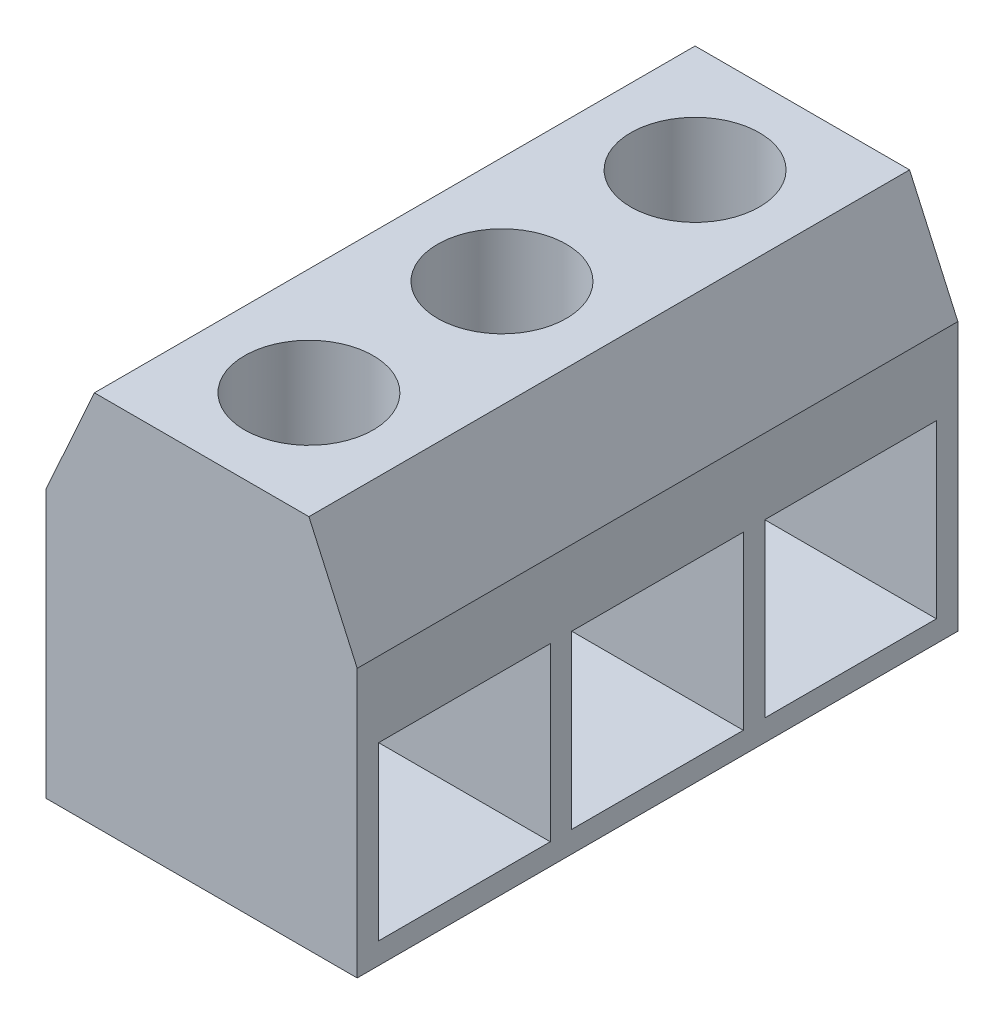
ISO-10303-21;
HEADER;
FILE_DESCRIPTION(('STEP AP214'),'2;1');
FILE_NAME('part.step','',(''),(''),'','','');
FILE_SCHEMA(('AUTOMOTIVE_DESIGN { 1 0 10303 214 1 1 1 1 }'));
ENDSEC;
DATA;
#1=APPLICATION_CONTEXT('core data for automotive mechanical design processes');
#2=APPLICATION_PROTOCOL_DEFINITION('international standard','automotive_design',2000,#1);
#3=PRODUCT_CONTEXT('',#1,'mechanical');
#4=PRODUCT('Part','Part','',(#3));
#5=PRODUCT_RELATED_PRODUCT_CATEGORY('part','',(#4));
#6=PRODUCT_DEFINITION_FORMATION('','',#4);
#7=PRODUCT_DEFINITION_CONTEXT('part definition',#1,'design');
#8=PRODUCT_DEFINITION('design','',#6,#7);
#9=PRODUCT_DEFINITION_SHAPE('','',#8);
#10=(LENGTH_UNIT() NAMED_UNIT(*) SI_UNIT(.MILLI.,.METRE.));
#11=(NAMED_UNIT(*) PLANE_ANGLE_UNIT() SI_UNIT($,.RADIAN.));
#12=(NAMED_UNIT(*) SI_UNIT($,.STERADIAN.) SOLID_ANGLE_UNIT());
#13=UNCERTAINTY_MEASURE_WITH_UNIT(LENGTH_MEASURE(1.E-05),#10,'distance_accuracy_value','');
#14=(GEOMETRIC_REPRESENTATION_CONTEXT(3) GLOBAL_UNCERTAINTY_ASSIGNED_CONTEXT((#13)) GLOBAL_UNIT_ASSIGNED_CONTEXT((#10,
#11,#12)) REPRESENTATION_CONTEXT('',''));
#15=CARTESIAN_POINT('',(0.,0.,0.));
#16=DIRECTION('',(0.,0.,1.));
#17=DIRECTION('',(1.,0.,0.));
#18=AXIS2_PLACEMENT_3D('',#15,#16,#17);
#19=CARTESIAN_POINT('',(0.,0.,14.224));
#20=DIRECTION('',(0.,1.,0.));
#21=DIRECTION('',(0.,0.,1.));
#22=AXIS2_PLACEMENT_3D('',#19,#20,#21);
#23=PLANE('',#22);
#24=DIRECTION('',(0.,0.,-1.));
#25=VECTOR('',#24,1.);
#26=CARTESIAN_POINT('',(1.778,0.,1.27));
#27=LINE('',#26,#25);
#28=CARTESIAN_POINT('',(1.778,0.,1.27));
#29=VERTEX_POINT('',#28);
#30=CARTESIAN_POINT('',(1.778,0.,0.));
#31=VERTEX_POINT('',#30);
#32=EDGE_CURVE('E198',#29,#31,#27,.T.);
#33=ORIENTED_EDGE('',*,*,#32,.T.);
#34=DIRECTION('',(1.,0.,0.));
#35=VECTOR('',#34,1.);
#36=CARTESIAN_POINT('',(0.,0.,0.));
#37=LINE('',#36,#35);
#38=CARTESIAN_POINT('',(7.366,0.,0.));
#39=VERTEX_POINT('',#38);
#40=EDGE_CURVE('E345',#31,#39,#37,.T.);
#41=ORIENTED_EDGE('',*,*,#40,.T.);
#42=DIRECTION('',(0.,0.,-1.));
#43=VECTOR('',#42,1.);
#44=CARTESIAN_POINT('',(7.366,0.,14.224));
#45=LINE('',#44,#43);
#46=CARTESIAN_POINT('',(7.366,0.,14.224));
#47=VERTEX_POINT('',#46);
#48=EDGE_CURVE('E44',#47,#39,#45,.T.);
#49=ORIENTED_EDGE('',*,*,#48,.F.);
#50=DIRECTION('',(1.,0.,0.));
#51=VECTOR('',#50,1.);
#52=CARTESIAN_POINT('',(0.,0.,14.224));
#53=LINE('',#52,#51);
#54=CARTESIAN_POINT('',(0.,0.,14.224));
#55=VERTEX_POINT('',#54);
#56=EDGE_CURVE('E331',#55,#47,#53,.T.);
#57=ORIENTED_EDGE('',*,*,#56,.F.);
#58=DIRECTION('',(0.,0.,-1.));
#59=VECTOR('',#58,1.);
#60=CARTESIAN_POINT('',(0.,0.,14.224));
#61=LINE('',#60,#59);
#62=CARTESIAN_POINT('',(0.,0.,0.));
#63=VERTEX_POINT('',#62);
#64=EDGE_CURVE('E11',#55,#63,#61,.T.);
#65=ORIENTED_EDGE('',*,*,#64,.T.);
#66=CARTESIAN_POINT('',(1.016,0.,0.));
#67=VERTEX_POINT('',#66);
#68=EDGE_CURVE('E346',#63,#67,#37,.T.);
#69=ORIENTED_EDGE('',*,*,#68,.T.);
#70=DIRECTION('',(0.,0.,-1.));
#71=VECTOR('',#70,1.);
#72=CARTESIAN_POINT('',(1.016,0.,1.27));
#73=LINE('',#72,#71);
#74=CARTESIAN_POINT('',(1.016,0.,1.27));
#75=VERTEX_POINT('',#74);
#76=EDGE_CURVE('E52',#75,#67,#73,.T.);
#77=ORIENTED_EDGE('',*,*,#76,.F.);
#78=DIRECTION('',(1.,0.,0.));
#79=VECTOR('',#78,1.);
#80=CARTESIAN_POINT('',(1.778,0.,1.27));
#81=LINE('',#80,#79);
#82=EDGE_CURVE('E192',#75,#29,#81,.T.);
#83=ORIENTED_EDGE('',*,*,#82,.T.);
#84=EDGE_LOOP('',(#33,#41,#49,#57,#65,#69,#77,#83));
#85=FACE_BOUND('',#84,.T.);
#86=ADVANCED_FACE('F35',(#85),#23,.F.);
#87=CARTESIAN_POINT('',(0.,0.,0.));
#88=DIRECTION('',(0.,0.,-1.));
#89=DIRECTION('',(-1.,0.,0.));
#90=AXIS2_PLACEMENT_3D('',#87,#88,#89);
#91=PLANE('',#90);
#92=ORIENTED_EDGE('',*,*,#40,.F.);
#93=DIRECTION('',(0.,1.,0.));
#94=VECTOR('',#93,1.);
#95=CARTESIAN_POINT('',(1.778,6.35,0.));
#96=LINE('',#95,#94);
#97=CARTESIAN_POINT('',(1.778,6.35,0.));
#98=VERTEX_POINT('',#97);
#99=EDGE_CURVE('E201',#31,#98,#96,.T.);
#100=ORIENTED_EDGE('',*,*,#99,.T.);
#101=DIRECTION('',(-1.,0.,0.));
#102=VECTOR('',#101,1.);
#103=CARTESIAN_POINT('',(1.016,6.35,0.));
#104=LINE('',#103,#102);
#105=CARTESIAN_POINT('',(1.016,6.35,0.));
#106=VERTEX_POINT('',#105);
#107=EDGE_CURVE('E209',#98,#106,#104,.T.);
#108=ORIENTED_EDGE('',*,*,#107,.T.);
#109=DIRECTION('',(0.,-1.,0.));
#110=VECTOR('',#109,1.);
#111=CARTESIAN_POINT('',(1.016,0.,0.));
#112=LINE('',#111,#110);
#113=EDGE_CURVE('E207',#106,#67,#112,.T.);
#114=ORIENTED_EDGE('',*,*,#113,.T.);
#115=ORIENTED_EDGE('',*,*,#68,.F.);
#116=DIRECTION('',(0.,-1.,0.));
#117=VECTOR('',#116,1.);
#118=CARTESIAN_POINT('',(0.,0.,0.));
#119=LINE('',#118,#117);
#120=CARTESIAN_POINT('',(0.,6.35,0.));
#121=VERTEX_POINT('',#120);
#122=EDGE_CURVE('E327',#121,#63,#119,.T.);
#123=ORIENTED_EDGE('',*,*,#122,.F.);
#124=DIRECTION('',(-0.410364677328798,-0.911921505175106,0.));
#125=VECTOR('',#124,1.);
#126=CARTESIAN_POINT('',(1.143,8.89,0.));
#127=LINE('',#126,#125);
#128=CARTESIAN_POINT('',(1.143,8.89,0.));
#129=VERTEX_POINT('',#128);
#130=EDGE_CURVE('E332',#129,#121,#127,.T.);
#131=ORIENTED_EDGE('',*,*,#130,.F.);
#132=DIRECTION('',(-1.,0.,0.));
#133=VECTOR('',#132,1.);
#134=CARTESIAN_POINT('',(1.143,8.89,0.));
#135=LINE('',#134,#133);
#136=CARTESIAN_POINT('',(6.223,8.89,0.));
#137=VERTEX_POINT('',#136);
#138=EDGE_CURVE('E352',#137,#129,#135,.T.);
#139=ORIENTED_EDGE('',*,*,#138,.F.);
#140=DIRECTION('',(-0.410364677328798,0.911921505175106,0.));
#141=VECTOR('',#140,1.);
#142=CARTESIAN_POINT('',(6.223,8.89,0.));
#143=LINE('',#142,#141);
#144=CARTESIAN_POINT('',(7.366,6.35,0.));
#145=VERTEX_POINT('',#144);
#146=EDGE_CURVE('E350',#145,#137,#143,.T.);
#147=ORIENTED_EDGE('',*,*,#146,.F.);
#148=DIRECTION('',(0.,1.,0.));
#149=VECTOR('',#148,1.);
#150=CARTESIAN_POINT('',(7.366,0.,0.));
#151=LINE('',#150,#149);
#152=EDGE_CURVE('E348',#39,#145,#151,.T.);
#153=ORIENTED_EDGE('',*,*,#152,.F.);
#154=EDGE_LOOP('',(#92,#100,#108,#114,#115,#123,#131,#139,#147,#153));
#155=FACE_BOUND('',#154,.T.);
#156=ADVANCED_FACE('F393',(#155),#91,.T.);
#157=CARTESIAN_POINT('',(0.,0.,14.224));
#158=DIRECTION('',(1.,0.,0.));
#159=DIRECTION('',(0.,0.,-1.));
#160=AXIS2_PLACEMENT_3D('',#157,#158,#159);
#161=PLANE('',#160);
#162=ORIENTED_EDGE('',*,*,#122,.T.);
#163=ORIENTED_EDGE('',*,*,#64,.F.);
#164=DIRECTION('',(0.,-1.,0.));
#165=VECTOR('',#164,1.);
#166=CARTESIAN_POINT('',(0.,0.,14.224));
#167=LINE('',#166,#165);
#168=CARTESIAN_POINT('',(0.,6.35,14.224));
#169=VERTEX_POINT('',#168);
#170=EDGE_CURVE('E328',#169,#55,#167,.T.);
#171=ORIENTED_EDGE('',*,*,#170,.F.);
#172=DIRECTION('',(0.,0.,-1.));
#173=VECTOR('',#172,1.);
#174=CARTESIAN_POINT('',(0.,6.35,14.224));
#175=LINE('',#174,#173);
#176=EDGE_CURVE('E342',#169,#121,#175,.T.);
#177=ORIENTED_EDGE('',*,*,#176,.T.);
#178=EDGE_LOOP('',(#162,#163,#171,#177));
#179=FACE_BOUND('',#178,.T.);
#180=ADVANCED_FACE('F37',(#179),#161,.F.);
#181=CARTESIAN_POINT('',(7.366,0.,14.224));
#182=DIRECTION('',(-1.,0.,0.));
#183=DIRECTION('',(0.,0.,1.));
#184=AXIS2_PLACEMENT_3D('',#181,#182,#183);
#185=PLANE('',#184);
#186=DIRECTION('',(0.,1.,0.));
#187=VECTOR('',#186,1.);
#188=CARTESIAN_POINT('',(7.366,0.508,0.508));
#189=LINE('',#188,#187);
#190=CARTESIAN_POINT('',(7.366,0.508,0.508));
#191=VERTEX_POINT('',#190);
#192=CARTESIAN_POINT('',(7.366,4.572,0.508));
#193=VERTEX_POINT('',#192);
#194=EDGE_CURVE('E237',#191,#193,#189,.T.);
#195=ORIENTED_EDGE('',*,*,#194,.F.);
#196=DIRECTION('',(0.,0.,-1.));
#197=VECTOR('',#196,1.);
#198=CARTESIAN_POINT('',(7.366,0.508,0.508));
#199=LINE('',#198,#197);
#200=CARTESIAN_POINT('',(7.366,0.508,4.572));
#201=VERTEX_POINT('',#200);
#202=EDGE_CURVE('E60',#201,#191,#199,.T.);
#203=ORIENTED_EDGE('',*,*,#202,.F.);
#204=DIRECTION('',(0.,-1.,0.));
#205=VECTOR('',#204,1.);
#206=CARTESIAN_POINT('',(7.366,0.508,4.572));
#207=LINE('',#206,#205);
#208=CARTESIAN_POINT('',(7.366,4.572,4.572));
#209=VERTEX_POINT('',#208);
#210=EDGE_CURVE('E226',#209,#201,#207,.T.);
#211=ORIENTED_EDGE('',*,*,#210,.F.);
#212=DIRECTION('',(0.,0.,1.));
#213=VECTOR('',#212,1.);
#214=CARTESIAN_POINT('',(7.366,4.572,0.508));
#215=LINE('',#214,#213);
#216=EDGE_CURVE('E240',#193,#209,#215,.T.);
#217=ORIENTED_EDGE('',*,*,#216,.F.);
#218=EDGE_LOOP('',(#195,#203,#211,#217));
#219=FACE_BOUND('',#218,.T.);
#220=DIRECTION('',(0.,1.,0.));
#221=VECTOR('',#220,1.);
#222=CARTESIAN_POINT('',(7.366,4.572,5.08));
#223=LINE('',#222,#221);
#224=CARTESIAN_POINT('',(7.366,0.508,5.08));
#225=VERTEX_POINT('',#224);
#226=CARTESIAN_POINT('',(7.366,4.572,5.08));
#227=VERTEX_POINT('',#226);
#228=EDGE_CURVE('E266',#225,#227,#223,.T.);
#229=ORIENTED_EDGE('',*,*,#228,.F.);
#230=DIRECTION('',(0.,0.,-1.));
#231=VECTOR('',#230,1.);
#232=CARTESIAN_POINT('',(7.366,0.508,7.112));
#233=LINE('',#232,#231);
#234=CARTESIAN_POINT('',(7.366,0.508,9.144));
#235=VERTEX_POINT('',#234);
#236=EDGE_CURVE('E256',#235,#225,#233,.T.);
#237=ORIENTED_EDGE('',*,*,#236,.F.);
#238=DIRECTION('',(0.,-1.,0.));
#239=VECTOR('',#238,1.);
#240=CARTESIAN_POINT('',(7.366,0.508,9.144));
#241=LINE('',#240,#239);
#242=CARTESIAN_POINT('',(7.366,4.572,9.144));
#243=VERTEX_POINT('',#242);
#244=EDGE_CURVE('E272',#243,#235,#241,.T.);
#245=ORIENTED_EDGE('',*,*,#244,.F.);
#246=DIRECTION('',(0.,0.,1.));
#247=VECTOR('',#246,1.);
#248=CARTESIAN_POINT('',(7.366,4.572,9.144));
#249=LINE('',#248,#247);
#250=EDGE_CURVE('E269',#227,#243,#249,.T.);
#251=ORIENTED_EDGE('',*,*,#250,.F.);
#252=EDGE_LOOP('',(#229,#237,#245,#251));
#253=FACE_BOUND('',#252,.T.);
#254=DIRECTION('',(0.,0.,1.));
#255=VECTOR('',#254,1.);
#256=CARTESIAN_POINT('',(7.366,4.572,13.716));
#257=LINE('',#256,#255);
#258=CARTESIAN_POINT('',(7.366,4.572,9.652));
#259=VERTEX_POINT('',#258);
#260=CARTESIAN_POINT('',(7.366,4.572,13.716));
#261=VERTEX_POINT('',#260);
#262=EDGE_CURVE('E301',#259,#261,#257,.T.);
#263=ORIENTED_EDGE('',*,*,#262,.F.);
#264=DIRECTION('',(0.,1.,0.));
#265=VECTOR('',#264,1.);
#266=CARTESIAN_POINT('',(7.366,0.508,9.652));
#267=LINE('',#266,#265);
#268=CARTESIAN_POINT('',(7.366,0.508,9.652));
#269=VERTEX_POINT('',#268);
#270=EDGE_CURVE('E299',#269,#259,#267,.T.);
#271=ORIENTED_EDGE('',*,*,#270,.F.);
#272=DIRECTION('',(0.,0.,-1.));
#273=VECTOR('',#272,1.);
#274=CARTESIAN_POINT('',(7.366,0.508,13.716));
#275=LINE('',#274,#273);
#276=CARTESIAN_POINT('',(7.366,0.508,13.716));
#277=VERTEX_POINT('',#276);
#278=EDGE_CURVE('E289',#277,#269,#275,.T.);
#279=ORIENTED_EDGE('',*,*,#278,.F.);
#280=DIRECTION('',(0.,-1.,0.));
#281=VECTOR('',#280,1.);
#282=CARTESIAN_POINT('',(7.366,0.508,13.716));
#283=LINE('',#282,#281);
#284=EDGE_CURVE('E304',#261,#277,#283,.T.);
#285=ORIENTED_EDGE('',*,*,#284,.F.);
#286=EDGE_LOOP('',(#263,#271,#279,#285));
#287=FACE_BOUND('',#286,.T.);
#288=ORIENTED_EDGE('',*,*,#152,.T.);
#289=DIRECTION('',(0.,0.,-1.));
#290=VECTOR('',#289,1.);
#291=CARTESIAN_POINT('',(7.366,6.35,14.224));
#292=LINE('',#291,#290);
#293=CARTESIAN_POINT('',(7.366,6.35,14.224));
#294=VERTEX_POINT('',#293);
#295=EDGE_CURVE('E363',#294,#145,#292,.T.);
#296=ORIENTED_EDGE('',*,*,#295,.F.);
#297=DIRECTION('',(0.,1.,0.));
#298=VECTOR('',#297,1.);
#299=CARTESIAN_POINT('',(7.366,0.,14.224));
#300=LINE('',#299,#298);
#301=EDGE_CURVE('E334',#47,#294,#300,.T.);
#302=ORIENTED_EDGE('',*,*,#301,.F.);
#303=ORIENTED_EDGE('',*,*,#48,.T.);
#304=EDGE_LOOP('',(#288,#296,#302,#303));
#305=FACE_BOUND('',#304,.T.);
#306=ADVANCED_FACE('F400',(#219,#253,#287,#305),#185,.F.);
#307=CARTESIAN_POINT('',(6.223,8.89,14.224));
#308=DIRECTION('',(-0.911921505175106,-0.410364677328798,0.));
#309=DIRECTION('',(0.410364677328798,-0.911921505175106,0.));
#310=AXIS2_PLACEMENT_3D('',#307,#308,#309);
#311=PLANE('',#310);
#312=ORIENTED_EDGE('',*,*,#146,.T.);
#313=DIRECTION('',(0.,0.,-1.));
#314=VECTOR('',#313,1.);
#315=CARTESIAN_POINT('',(6.223,8.89,14.224));
#316=LINE('',#315,#314);
#317=CARTESIAN_POINT('',(6.223,8.89,14.224));
#318=VERTEX_POINT('',#317);
#319=EDGE_CURVE('E360',#318,#137,#316,.T.);
#320=ORIENTED_EDGE('',*,*,#319,.F.);
#321=DIRECTION('',(-0.410364677328798,0.911921505175106,0.));
#322=VECTOR('',#321,1.);
#323=CARTESIAN_POINT('',(6.223,8.89,14.224));
#324=LINE('',#323,#322);
#325=EDGE_CURVE('E336',#294,#318,#324,.T.);
#326=ORIENTED_EDGE('',*,*,#325,.F.);
#327=ORIENTED_EDGE('',*,*,#295,.T.);
#328=EDGE_LOOP('',(#312,#320,#326,#327));
#329=FACE_BOUND('',#328,.T.);
#330=ADVANCED_FACE('F403',(#329),#311,.F.);
#331=CARTESIAN_POINT('',(1.143,8.89,14.224));
#332=DIRECTION('',(0.,-1.,0.));
#333=DIRECTION('',(0.,0.,-1.));
#334=AXIS2_PLACEMENT_3D('',#331,#332,#333);
#335=PLANE('',#334);
#336=CARTESIAN_POINT('',(3.683,8.89,7.112));
#337=DIRECTION('',(0.,1.,0.));
#338=DIRECTION('',(0.,0.,1.));
#339=AXIS2_PLACEMENT_3D('',#336,#337,#338);
#340=CIRCLE('',#339,1.524);
#341=CARTESIAN_POINT('',(3.683,8.89,8.636));
#342=VERTEX_POINT('',#341);
#343=EDGE_CURVE('E318',#342,#342,#340,.T.);
#344=ORIENTED_EDGE('',*,*,#343,.F.);
#345=EDGE_LOOP('',(#344));
#346=FACE_BOUND('',#345,.T.);
#347=CARTESIAN_POINT('',(3.683,8.89,11.684));
#348=DIRECTION('',(0.,1.,0.));
#349=DIRECTION('',(0.,0.,-1.));
#350=AXIS2_PLACEMENT_3D('',#347,#348,#349);
#351=CIRCLE('',#350,1.524);
#352=CARTESIAN_POINT('',(3.683,8.89,13.208));
#353=VERTEX_POINT('',#352);
#354=EDGE_CURVE('E321',#353,#353,#351,.T.);
#355=ORIENTED_EDGE('',*,*,#354,.F.);
#356=EDGE_LOOP('',(#355));
#357=FACE_BOUND('',#356,.T.);
#358=CARTESIAN_POINT('',(3.683,8.89,2.54));
#359=DIRECTION('',(0.,1.,0.));
#360=DIRECTION('',(0.,0.,1.));
#361=AXIS2_PLACEMENT_3D('',#358,#359,#360);
#362=CIRCLE('',#361,1.524);
#363=CARTESIAN_POINT('',(3.683,8.89,4.064));
#364=VERTEX_POINT('',#363);
#365=EDGE_CURVE('E324',#364,#364,#362,.T.);
#366=ORIENTED_EDGE('',*,*,#365,.F.);
#367=EDGE_LOOP('',(#366));
#368=FACE_BOUND('',#367,.T.);
#369=ORIENTED_EDGE('',*,*,#138,.T.);
#370=DIRECTION('',(0.,0.,-1.));
#371=VECTOR('',#370,1.);
#372=CARTESIAN_POINT('',(1.143,8.89,14.224));
#373=LINE('',#372,#371);
#374=CARTESIAN_POINT('',(1.143,8.89,14.224));
#375=VERTEX_POINT('',#374);
#376=EDGE_CURVE('E357',#375,#129,#373,.T.);
#377=ORIENTED_EDGE('',*,*,#376,.F.);
#378=DIRECTION('',(-1.,0.,0.));
#379=VECTOR('',#378,1.);
#380=CARTESIAN_POINT('',(1.143,8.89,14.224));
#381=LINE('',#380,#379);
#382=EDGE_CURVE('E338',#318,#375,#381,.T.);
#383=ORIENTED_EDGE('',*,*,#382,.F.);
#384=ORIENTED_EDGE('',*,*,#319,.T.);
#385=EDGE_LOOP('',(#369,#377,#383,#384));
#386=FACE_BOUND('',#385,.T.);
#387=ADVANCED_FACE('F407',(#346,#357,#368,#386),#335,.F.);
#388=CARTESIAN_POINT('',(1.143,8.89,14.224));
#389=DIRECTION('',(0.911921505175106,-0.410364677328798,0.));
#390=DIRECTION('',(0.410364677328798,0.911921505175106,0.));
#391=AXIS2_PLACEMENT_3D('',#388,#389,#390);
#392=PLANE('',#391);
#393=ORIENTED_EDGE('',*,*,#130,.T.);
#394=ORIENTED_EDGE('',*,*,#176,.F.);
#395=DIRECTION('',(-0.410364677328798,-0.911921505175106,0.));
#396=VECTOR('',#395,1.);
#397=CARTESIAN_POINT('',(1.143,8.89,14.224));
#398=LINE('',#397,#396);
#399=EDGE_CURVE('E340',#375,#169,#398,.T.);
#400=ORIENTED_EDGE('',*,*,#399,.F.);
#401=ORIENTED_EDGE('',*,*,#376,.T.);
#402=EDGE_LOOP('',(#393,#394,#400,#401));
#403=FACE_BOUND('',#402,.T.);
#404=ADVANCED_FACE('F411',(#403),#392,.F.);
#405=CARTESIAN_POINT('',(0.,0.,14.224));
#406=DIRECTION('',(0.,0.,-1.));
#407=DIRECTION('',(-1.,0.,0.));
#408=AXIS2_PLACEMENT_3D('',#405,#406,#407);
#409=PLANE('',#408);
#410=ORIENTED_EDGE('',*,*,#170,.T.);
#411=ORIENTED_EDGE('',*,*,#56,.T.);
#412=ORIENTED_EDGE('',*,*,#301,.T.);
#413=ORIENTED_EDGE('',*,*,#325,.T.);
#414=ORIENTED_EDGE('',*,*,#382,.T.);
#415=ORIENTED_EDGE('',*,*,#399,.T.);
#416=EDGE_LOOP('',(#410,#411,#412,#413,#414,#415));
#417=FACE_BOUND('',#416,.T.);
#418=ADVANCED_FACE('F414',(#417),#409,.F.);
#419=CARTESIAN_POINT('',(3.683,0.508,2.54));
#420=DIRECTION('',(0.,1.,0.));
#421=DIRECTION('',(0.,0.,1.));
#422=AXIS2_PLACEMENT_3D('',#419,#420,#421);
#423=CYLINDRICAL_SURFACE('',#422,1.524);
#424=CARTESIAN_POINT('',(3.683,4.572,2.54));
#425=DIRECTION('',(0.,1.,0.));
#426=DIRECTION('',(0.,0.,1.));
#427=AXIS2_PLACEMENT_3D('',#424,#425,#426);
#428=CIRCLE('',#427,1.524);
#429=CARTESIAN_POINT('',(3.683,4.572,4.064));
#430=VERTEX_POINT('',#429);
#431=EDGE_CURVE('E39',#430,#430,#428,.F.);
#432=CARTESIAN_POINT('',(3.683,4.572,4.064));
#433=CARTESIAN_POINT('',(3.683,4.61697916666667,4.064));
#434=CARTESIAN_POINT('',(3.683,4.66195833333333,4.064));
#435=CARTESIAN_POINT('',(3.683,4.75191666666667,4.064));
#436=CARTESIAN_POINT('',(3.683,4.79689583333333,4.064));
#437=CARTESIAN_POINT('',(3.683,4.88685416666666,4.064));
#438=CARTESIAN_POINT('',(3.683,4.93183333333333,4.064));
#439=CARTESIAN_POINT('',(3.683,5.02179166666667,4.064));
#440=CARTESIAN_POINT('',(3.683,5.06677083333333,4.064));
#441=CARTESIAN_POINT('',(3.683,5.15672916666667,4.064));
#442=CARTESIAN_POINT('',(3.683,5.20170833333333,4.064));
#443=CARTESIAN_POINT('',(3.683,5.29166666666667,4.064));
#444=CARTESIAN_POINT('',(3.683,5.33664583333333,4.064));
#445=CARTESIAN_POINT('',(3.683,5.42660416666667,4.064));
#446=CARTESIAN_POINT('',(3.683,5.47158333333333,4.064));
#447=CARTESIAN_POINT('',(3.683,5.56154166666667,4.064));
#448=CARTESIAN_POINT('',(3.683,5.60652083333333,4.064));
#449=CARTESIAN_POINT('',(3.683,5.69647916666667,4.064));
#450=CARTESIAN_POINT('',(3.683,5.74145833333333,4.064));
#451=CARTESIAN_POINT('',(3.683,5.83141666666666,4.064));
#452=CARTESIAN_POINT('',(3.683,5.87639583333333,4.064));
#453=CARTESIAN_POINT('',(3.683,5.96635416666667,4.064));
#454=CARTESIAN_POINT('',(3.683,6.01133333333333,4.064));
#455=CARTESIAN_POINT('',(3.683,6.10129166666667,4.064));
#456=CARTESIAN_POINT('',(3.683,6.14627083333333,4.064));
#457=CARTESIAN_POINT('',(3.683,6.23622916666667,4.064));
#458=CARTESIAN_POINT('',(3.683,6.28120833333333,4.064));
#459=CARTESIAN_POINT('',(3.683,6.37116666666667,4.064));
#460=CARTESIAN_POINT('',(3.683,6.41614583333333,4.064));
#461=CARTESIAN_POINT('',(3.683,6.50610416666667,4.064));
#462=CARTESIAN_POINT('',(3.683,6.55108333333333,4.064));
#463=CARTESIAN_POINT('',(3.683,6.64104166666667,4.064));
#464=CARTESIAN_POINT('',(3.683,6.68602083333333,4.064));
#465=CARTESIAN_POINT('',(3.683,6.77597916666667,4.064));
#466=CARTESIAN_POINT('',(3.683,6.82095833333333,4.064));
#467=CARTESIAN_POINT('',(3.683,6.91091666666667,4.064));
#468=CARTESIAN_POINT('',(3.683,6.95589583333333,4.064));
#469=CARTESIAN_POINT('',(3.683,7.04585416666667,4.064));
#470=CARTESIAN_POINT('',(3.683,7.09083333333333,4.064));
#471=CARTESIAN_POINT('',(3.683,7.18079166666667,4.064));
#472=CARTESIAN_POINT('',(3.683,7.22577083333333,4.064));
#473=CARTESIAN_POINT('',(3.683,7.31572916666667,4.064));
#474=CARTESIAN_POINT('',(3.683,7.36070833333333,4.064));
#475=CARTESIAN_POINT('',(3.683,7.45066666666667,4.064));
#476=CARTESIAN_POINT('',(3.683,7.49564583333333,4.064));
#477=CARTESIAN_POINT('',(3.683,7.58560416666667,4.064));
#478=CARTESIAN_POINT('',(3.683,7.63058333333333,4.064));
#479=CARTESIAN_POINT('',(3.683,7.72054166666667,4.064));
#480=CARTESIAN_POINT('',(3.683,7.76552083333333,4.064));
#481=CARTESIAN_POINT('',(3.683,7.85547916666667,4.064));
#482=CARTESIAN_POINT('',(3.683,7.90045833333333,4.064));
#483=CARTESIAN_POINT('',(3.683,7.99041666666667,4.064));
#484=CARTESIAN_POINT('',(3.683,8.03539583333333,4.064));
#485=CARTESIAN_POINT('',(3.683,8.12535416666667,4.064));
#486=CARTESIAN_POINT('',(3.683,8.17033333333333,4.064));
#487=CARTESIAN_POINT('',(3.683,8.26029166666667,4.064));
#488=CARTESIAN_POINT('',(3.683,8.30527083333333,4.064));
#489=CARTESIAN_POINT('',(3.683,8.39522916666666,4.064));
#490=CARTESIAN_POINT('',(3.683,8.44020833333333,4.064));
#491=CARTESIAN_POINT('',(3.683,8.53016666666666,4.064));
#492=CARTESIAN_POINT('',(3.683,8.57514583333333,4.064));
#493=CARTESIAN_POINT('',(3.683,8.66510416666667,4.064));
#494=CARTESIAN_POINT('',(3.683,8.71008333333333,4.064));
#495=CARTESIAN_POINT('',(3.683,8.80004166666667,4.064));
#496=CARTESIAN_POINT('',(3.683,8.84502083333333,4.064));
#497=CARTESIAN_POINT('',(3.683,8.89,4.064));
#498=B_SPLINE_CURVE_WITH_KNOTS('',3,(#432,#433,#434,#435,#436,#437,#438,#439,#440,#441,#442,
#443,#444,#445,#446,#447,#448,#449,#450,#451,#452,#453,#454,#455,#456,#457,#458,#459,#460,#461,
#462,#463,#464,#465,#466,#467,#468,#469,#470,#471,#472,#473,#474,#475,#476,#477,#478,#479,#480,
#481,#482,#483,#484,#485,#486,#487,#488,#489,#490,#491,#492,#493,#494,#495,#496,#497),
.UNSPECIFIED.,.F.,.F.,(4,2,2,2,2,2,2,2,2,2,2,2,2,2,2,2,2,2,2,2,2,2,2,2,2,2,2,2,2,2,2,2,4),(0.,
0.1349375,0.269875,0.4048125,0.53975,0.6746875,0.809625,0.9445625,1.0795,1.2144375,1.349375,
1.4843125,1.61925,1.7541875,1.889125,2.0240625,2.159,2.2939375,2.428875,2.5638125,2.69875,
2.8336875,2.968625,3.1035625,3.2385,3.3734375,3.508375,3.6433125,3.77825,3.9131875,4.048125,
4.1830625,4.318),.UNSPECIFIED.);
#499=EDGE_CURVE('BSEAM419',#430,#364,#498,.T.);
#500=ORIENTED_EDGE('',*,*,#431,.T.);
#501=ORIENTED_EDGE('',*,*,#365,.T.);
#502=ORIENTED_EDGE('',*,*,#499,.T.);
#503=ORIENTED_EDGE('',*,*,#499,.F.);
#504=EDGE_LOOP('',(#500,#502,#501,#503));
#505=FACE_BOUND('',#504,.T.);
#506=ADVANCED_FACE('F419',(#505),#423,.F.);
#507=CARTESIAN_POINT('',(3.683,0.508,11.684));
#508=DIRECTION('',(0.,1.,0.));
#509=DIRECTION('',(0.,0.,1.));
#510=AXIS2_PLACEMENT_3D('',#507,#508,#509);
#511=CYLINDRICAL_SURFACE('',#510,1.524);
#512=CARTESIAN_POINT('',(3.683,4.572,11.684));
#513=DIRECTION('',(0.,1.,0.));
#514=DIRECTION('',(0.,0.,1.));
#515=AXIS2_PLACEMENT_3D('',#512,#513,#514);
#516=CIRCLE('',#515,1.524);
#517=CARTESIAN_POINT('',(3.683,4.572,13.208));
#518=VERTEX_POINT('',#517);
#519=EDGE_CURVE('E311',#518,#518,#516,.F.);
#520=CARTESIAN_POINT('',(3.683,4.572,13.208));
#521=CARTESIAN_POINT('',(3.683,4.61697916666667,13.208));
#522=CARTESIAN_POINT('',(3.683,4.66195833333333,13.208));
#523=CARTESIAN_POINT('',(3.683,4.75191666666667,13.208));
#524=CARTESIAN_POINT('',(3.683,4.79689583333333,13.208));
#525=CARTESIAN_POINT('',(3.683,4.88685416666666,13.208));
#526=CARTESIAN_POINT('',(3.683,4.93183333333333,13.208));
#527=CARTESIAN_POINT('',(3.683,5.02179166666667,13.208));
#528=CARTESIAN_POINT('',(3.683,5.06677083333333,13.208));
#529=CARTESIAN_POINT('',(3.683,5.15672916666667,13.208));
#530=CARTESIAN_POINT('',(3.683,5.20170833333333,13.208));
#531=CARTESIAN_POINT('',(3.683,5.29166666666667,13.208));
#532=CARTESIAN_POINT('',(3.683,5.33664583333333,13.208));
#533=CARTESIAN_POINT('',(3.683,5.42660416666667,13.208));
#534=CARTESIAN_POINT('',(3.683,5.47158333333333,13.208));
#535=CARTESIAN_POINT('',(3.683,5.56154166666667,13.208));
#536=CARTESIAN_POINT('',(3.683,5.60652083333333,13.208));
#537=CARTESIAN_POINT('',(3.683,5.69647916666667,13.208));
#538=CARTESIAN_POINT('',(3.683,5.74145833333333,13.208));
#539=CARTESIAN_POINT('',(3.683,5.83141666666666,13.208));
#540=CARTESIAN_POINT('',(3.683,5.87639583333333,13.208));
#541=CARTESIAN_POINT('',(3.683,5.96635416666667,13.208));
#542=CARTESIAN_POINT('',(3.683,6.01133333333333,13.208));
#543=CARTESIAN_POINT('',(3.683,6.10129166666667,13.208));
#544=CARTESIAN_POINT('',(3.683,6.14627083333333,13.208));
#545=CARTESIAN_POINT('',(3.683,6.23622916666667,13.208));
#546=CARTESIAN_POINT('',(3.683,6.28120833333333,13.208));
#547=CARTESIAN_POINT('',(3.683,6.37116666666667,13.208));
#548=CARTESIAN_POINT('',(3.683,6.41614583333333,13.208));
#549=CARTESIAN_POINT('',(3.683,6.50610416666667,13.208));
#550=CARTESIAN_POINT('',(3.683,6.55108333333333,13.208));
#551=CARTESIAN_POINT('',(3.683,6.64104166666667,13.208));
#552=CARTESIAN_POINT('',(3.683,6.68602083333333,13.208));
#553=CARTESIAN_POINT('',(3.683,6.77597916666667,13.208));
#554=CARTESIAN_POINT('',(3.683,6.82095833333333,13.208));
#555=CARTESIAN_POINT('',(3.683,6.91091666666667,13.208));
#556=CARTESIAN_POINT('',(3.683,6.95589583333333,13.208));
#557=CARTESIAN_POINT('',(3.683,7.04585416666667,13.208));
#558=CARTESIAN_POINT('',(3.683,7.09083333333333,13.208));
#559=CARTESIAN_POINT('',(3.683,7.18079166666667,13.208));
#560=CARTESIAN_POINT('',(3.683,7.22577083333333,13.208));
#561=CARTESIAN_POINT('',(3.683,7.31572916666667,13.208));
#562=CARTESIAN_POINT('',(3.683,7.36070833333333,13.208));
#563=CARTESIAN_POINT('',(3.683,7.45066666666667,13.208));
#564=CARTESIAN_POINT('',(3.683,7.49564583333333,13.208));
#565=CARTESIAN_POINT('',(3.683,7.58560416666667,13.208));
#566=CARTESIAN_POINT('',(3.683,7.63058333333333,13.208));
#567=CARTESIAN_POINT('',(3.683,7.72054166666667,13.208));
#568=CARTESIAN_POINT('',(3.683,7.76552083333333,13.208));
#569=CARTESIAN_POINT('',(3.683,7.85547916666667,13.208));
#570=CARTESIAN_POINT('',(3.683,7.90045833333333,13.208));
#571=CARTESIAN_POINT('',(3.683,7.99041666666667,13.208));
#572=CARTESIAN_POINT('',(3.683,8.03539583333333,13.208));
#573=CARTESIAN_POINT('',(3.683,8.12535416666667,13.208));
#574=CARTESIAN_POINT('',(3.683,8.17033333333333,13.208));
#575=CARTESIAN_POINT('',(3.683,8.26029166666667,13.208));
#576=CARTESIAN_POINT('',(3.683,8.30527083333333,13.208));
#577=CARTESIAN_POINT('',(3.683,8.39522916666666,13.208));
#578=CARTESIAN_POINT('',(3.683,8.44020833333333,13.208));
#579=CARTESIAN_POINT('',(3.683,8.53016666666666,13.208));
#580=CARTESIAN_POINT('',(3.683,8.57514583333333,13.208));
#581=CARTESIAN_POINT('',(3.683,8.66510416666667,13.208));
#582=CARTESIAN_POINT('',(3.683,8.71008333333333,13.208));
#583=CARTESIAN_POINT('',(3.683,8.80004166666667,13.208));
#584=CARTESIAN_POINT('',(3.683,8.84502083333333,13.208));
#585=CARTESIAN_POINT('',(3.683,8.89,13.208));
#586=B_SPLINE_CURVE_WITH_KNOTS('',3,(#520,#521,#522,#523,#524,#525,#526,#527,#528,#529,#530,
#531,#532,#533,#534,#535,#536,#537,#538,#539,#540,#541,#542,#543,#544,#545,#546,#547,#548,#549,
#550,#551,#552,#553,#554,#555,#556,#557,#558,#559,#560,#561,#562,#563,#564,#565,#566,#567,#568,
#569,#570,#571,#572,#573,#574,#575,#576,#577,#578,#579,#580,#581,#582,#583,#584,#585),
.UNSPECIFIED.,.F.,.F.,(4,2,2,2,2,2,2,2,2,2,2,2,2,2,2,2,2,2,2,2,2,2,2,2,2,2,2,2,2,2,2,2,4),(0.,
0.1349375,0.269875,0.4048125,0.53975,0.6746875,0.809625,0.9445625,1.0795,1.2144375,1.349375,
1.4843125,1.61925,1.7541875,1.889125,2.0240625,2.159,2.2939375,2.428875,2.5638125,2.69875,
2.8336875,2.968625,3.1035625,3.2385,3.3734375,3.508375,3.6433125,3.77825,3.9131875,4.048125,
4.1830625,4.318),.UNSPECIFIED.);
#587=EDGE_CURVE('BSEAM423',#518,#353,#586,.T.);
#588=ORIENTED_EDGE('',*,*,#519,.T.);
#589=ORIENTED_EDGE('',*,*,#354,.T.);
#590=ORIENTED_EDGE('',*,*,#587,.T.);
#591=ORIENTED_EDGE('',*,*,#587,.F.);
#592=EDGE_LOOP('',(#588,#590,#589,#591));
#593=FACE_BOUND('',#592,.T.);
#594=ADVANCED_FACE('F423',(#593),#511,.F.);
#595=CARTESIAN_POINT('',(3.683,0.508,7.112));
#596=DIRECTION('',(0.,1.,0.));
#597=DIRECTION('',(0.,0.,1.));
#598=AXIS2_PLACEMENT_3D('',#595,#596,#597);
#599=CYLINDRICAL_SURFACE('',#598,1.524);
#600=CARTESIAN_POINT('',(3.683,4.572,7.112));
#601=DIRECTION('',(0.,1.,0.));
#602=DIRECTION('',(0.,0.,1.));
#603=AXIS2_PLACEMENT_3D('',#600,#601,#602);
#604=CIRCLE('',#603,1.524);
#605=CARTESIAN_POINT('',(3.683,4.572,8.636));
#606=VERTEX_POINT('',#605);
#607=EDGE_CURVE('E279',#606,#606,#604,.F.);
#608=CARTESIAN_POINT('',(3.683,4.572,8.636));
#609=CARTESIAN_POINT('',(3.683,4.61697916666667,8.636));
#610=CARTESIAN_POINT('',(3.683,4.66195833333333,8.636));
#611=CARTESIAN_POINT('',(3.683,4.75191666666667,8.636));
#612=CARTESIAN_POINT('',(3.683,4.79689583333333,8.636));
#613=CARTESIAN_POINT('',(3.683,4.88685416666666,8.636));
#614=CARTESIAN_POINT('',(3.683,4.93183333333333,8.636));
#615=CARTESIAN_POINT('',(3.683,5.02179166666667,8.636));
#616=CARTESIAN_POINT('',(3.683,5.06677083333333,8.636));
#617=CARTESIAN_POINT('',(3.683,5.15672916666667,8.636));
#618=CARTESIAN_POINT('',(3.683,5.20170833333333,8.636));
#619=CARTESIAN_POINT('',(3.683,5.29166666666667,8.636));
#620=CARTESIAN_POINT('',(3.683,5.33664583333333,8.636));
#621=CARTESIAN_POINT('',(3.683,5.42660416666667,8.636));
#622=CARTESIAN_POINT('',(3.683,5.47158333333333,8.636));
#623=CARTESIAN_POINT('',(3.683,5.56154166666667,8.636));
#624=CARTESIAN_POINT('',(3.683,5.60652083333333,8.636));
#625=CARTESIAN_POINT('',(3.683,5.69647916666667,8.636));
#626=CARTESIAN_POINT('',(3.683,5.74145833333333,8.636));
#627=CARTESIAN_POINT('',(3.683,5.83141666666666,8.636));
#628=CARTESIAN_POINT('',(3.683,5.87639583333333,8.636));
#629=CARTESIAN_POINT('',(3.683,5.96635416666667,8.636));
#630=CARTESIAN_POINT('',(3.683,6.01133333333333,8.636));
#631=CARTESIAN_POINT('',(3.683,6.10129166666667,8.636));
#632=CARTESIAN_POINT('',(3.683,6.14627083333333,8.636));
#633=CARTESIAN_POINT('',(3.683,6.23622916666667,8.636));
#634=CARTESIAN_POINT('',(3.683,6.28120833333333,8.636));
#635=CARTESIAN_POINT('',(3.683,6.37116666666667,8.636));
#636=CARTESIAN_POINT('',(3.683,6.41614583333333,8.636));
#637=CARTESIAN_POINT('',(3.683,6.50610416666667,8.636));
#638=CARTESIAN_POINT('',(3.683,6.55108333333333,8.636));
#639=CARTESIAN_POINT('',(3.683,6.64104166666667,8.636));
#640=CARTESIAN_POINT('',(3.683,6.68602083333333,8.636));
#641=CARTESIAN_POINT('',(3.683,6.77597916666667,8.636));
#642=CARTESIAN_POINT('',(3.683,6.82095833333333,8.636));
#643=CARTESIAN_POINT('',(3.683,6.91091666666667,8.636));
#644=CARTESIAN_POINT('',(3.683,6.95589583333333,8.636));
#645=CARTESIAN_POINT('',(3.683,7.04585416666667,8.636));
#646=CARTESIAN_POINT('',(3.683,7.09083333333333,8.636));
#647=CARTESIAN_POINT('',(3.683,7.18079166666667,8.636));
#648=CARTESIAN_POINT('',(3.683,7.22577083333333,8.636));
#649=CARTESIAN_POINT('',(3.683,7.31572916666667,8.636));
#650=CARTESIAN_POINT('',(3.683,7.36070833333333,8.636));
#651=CARTESIAN_POINT('',(3.683,7.45066666666667,8.636));
#652=CARTESIAN_POINT('',(3.683,7.49564583333333,8.636));
#653=CARTESIAN_POINT('',(3.683,7.58560416666667,8.636));
#654=CARTESIAN_POINT('',(3.683,7.63058333333333,8.636));
#655=CARTESIAN_POINT('',(3.683,7.72054166666667,8.636));
#656=CARTESIAN_POINT('',(3.683,7.76552083333333,8.636));
#657=CARTESIAN_POINT('',(3.683,7.85547916666667,8.636));
#658=CARTESIAN_POINT('',(3.683,7.90045833333333,8.636));
#659=CARTESIAN_POINT('',(3.683,7.99041666666667,8.636));
#660=CARTESIAN_POINT('',(3.683,8.03539583333333,8.636));
#661=CARTESIAN_POINT('',(3.683,8.12535416666667,8.636));
#662=CARTESIAN_POINT('',(3.683,8.17033333333333,8.636));
#663=CARTESIAN_POINT('',(3.683,8.26029166666667,8.636));
#664=CARTESIAN_POINT('',(3.683,8.30527083333333,8.636));
#665=CARTESIAN_POINT('',(3.683,8.39522916666666,8.636));
#666=CARTESIAN_POINT('',(3.683,8.44020833333333,8.636));
#667=CARTESIAN_POINT('',(3.683,8.53016666666666,8.636));
#668=CARTESIAN_POINT('',(3.683,8.57514583333333,8.636));
#669=CARTESIAN_POINT('',(3.683,8.66510416666667,8.636));
#670=CARTESIAN_POINT('',(3.683,8.71008333333333,8.636));
#671=CARTESIAN_POINT('',(3.683,8.80004166666667,8.636));
#672=CARTESIAN_POINT('',(3.683,8.84502083333333,8.636));
#673=CARTESIAN_POINT('',(3.683,8.89,8.636));
#674=B_SPLINE_CURVE_WITH_KNOTS('',3,(#608,#609,#610,#611,#612,#613,#614,#615,#616,#617,#618,
#619,#620,#621,#622,#623,#624,#625,#626,#627,#628,#629,#630,#631,#632,#633,#634,#635,#636,#637,
#638,#639,#640,#641,#642,#643,#644,#645,#646,#647,#648,#649,#650,#651,#652,#653,#654,#655,#656,
#657,#658,#659,#660,#661,#662,#663,#664,#665,#666,#667,#668,#669,#670,#671,#672,#673),
.UNSPECIFIED.,.F.,.F.,(4,2,2,2,2,2,2,2,2,2,2,2,2,2,2,2,2,2,2,2,2,2,2,2,2,2,2,2,2,2,2,2,4),(0.,
0.1349375,0.269875,0.4048125,0.53975,0.6746875,0.809625,0.9445625,1.0795,1.2144375,1.349375,
1.4843125,1.61925,1.7541875,1.889125,2.0240625,2.159,2.2939375,2.428875,2.5638125,2.69875,
2.8336875,2.968625,3.1035625,3.2385,3.3734375,3.508375,3.6433125,3.77825,3.9131875,4.048125,
4.1830625,4.318),.UNSPECIFIED.);
#675=EDGE_CURVE('BSEAM372',#606,#342,#674,.T.);
#676=ORIENTED_EDGE('',*,*,#607,.T.);
#677=ORIENTED_EDGE('',*,*,#343,.T.);
#678=ORIENTED_EDGE('',*,*,#675,.T.);
#679=ORIENTED_EDGE('',*,*,#675,.F.);
#680=EDGE_LOOP('',(#676,#678,#677,#679));
#681=FACE_BOUND('',#680,.T.);
#682=ADVANCED_FACE('F372',(#681),#599,.F.);
#683=CARTESIAN_POINT('',(2.032,4.572,13.716));
#684=DIRECTION('',(0.,1.,0.));
#685=DIRECTION('',(0.,0.,1.));
#686=AXIS2_PLACEMENT_3D('',#683,#684,#685);
#687=PLANE('',#686);
#688=ORIENTED_EDGE('',*,*,#262,.T.);
#689=DIRECTION('',(1.,0.,0.));
#690=VECTOR('',#689,1.);
#691=CARTESIAN_POINT('',(2.032,4.572,13.716));
#692=LINE('',#691,#690);
#693=CARTESIAN_POINT('',(2.032,4.572,13.716));
#694=VERTEX_POINT('',#693);
#695=EDGE_CURVE('E314',#694,#261,#692,.T.);
#696=ORIENTED_EDGE('',*,*,#695,.F.);
#697=DIRECTION('',(0.,0.,1.));
#698=VECTOR('',#697,1.);
#699=CARTESIAN_POINT('',(2.032,4.572,13.716));
#700=LINE('',#699,#698);
#701=CARTESIAN_POINT('',(2.032,4.572,9.652));
#702=VERTEX_POINT('',#701);
#703=EDGE_CURVE('E288',#702,#694,#700,.T.);
#704=ORIENTED_EDGE('',*,*,#703,.F.);
#705=DIRECTION('',(1.,0.,0.));
#706=VECTOR('',#705,1.);
#707=CARTESIAN_POINT('',(2.032,4.572,9.652));
#708=LINE('',#707,#706);
#709=EDGE_CURVE('E298',#702,#259,#708,.T.);
#710=ORIENTED_EDGE('',*,*,#709,.T.);
#711=EDGE_LOOP('',(#688,#696,#704,#710));
#712=FACE_BOUND('',#711,.T.);
#713=ORIENTED_EDGE('',*,*,#519,.F.);
#714=EDGE_LOOP('',(#713));
#715=FACE_BOUND('',#714,.T.);
#716=ADVANCED_FACE('F434',(#712,#715),#687,.F.);
#717=CARTESIAN_POINT('',(2.032,0.508,9.652));
#718=DIRECTION('',(0.,0.,-1.));
#719=DIRECTION('',(-1.,0.,0.));
#720=AXIS2_PLACEMENT_3D('',#717,#718,#719);
#721=PLANE('',#720);
#722=ORIENTED_EDGE('',*,*,#270,.T.);
#723=ORIENTED_EDGE('',*,*,#709,.F.);
#724=DIRECTION('',(0.,1.,0.));
#725=VECTOR('',#724,1.);
#726=CARTESIAN_POINT('',(2.032,0.508,9.652));
#727=LINE('',#726,#725);
#728=CARTESIAN_POINT('',(2.032,0.508,9.652));
#729=VERTEX_POINT('',#728);
#730=EDGE_CURVE('E285',#729,#702,#727,.T.);
#731=ORIENTED_EDGE('',*,*,#730,.F.);
#732=DIRECTION('',(1.,0.,0.));
#733=VECTOR('',#732,1.);
#734=CARTESIAN_POINT('',(2.032,0.508,9.652));
#735=LINE('',#734,#733);
#736=EDGE_CURVE('E309',#729,#269,#735,.T.);
#737=ORIENTED_EDGE('',*,*,#736,.T.);
#738=EDGE_LOOP('',(#722,#723,#731,#737));
#739=FACE_BOUND('',#738,.T.);
#740=ADVANCED_FACE('F441',(#739),#721,.F.);
#741=CARTESIAN_POINT('',(2.032,0.508,13.716));
#742=DIRECTION('',(0.,0.,1.));
#743=DIRECTION('',(1.,0.,0.));
#744=AXIS2_PLACEMENT_3D('',#741,#742,#743);
#745=PLANE('',#744);
#746=ORIENTED_EDGE('',*,*,#284,.T.);
#747=DIRECTION('',(1.,0.,0.));
#748=VECTOR('',#747,1.);
#749=CARTESIAN_POINT('',(2.032,0.508,13.716));
#750=LINE('',#749,#748);
#751=CARTESIAN_POINT('',(2.032,0.508,13.716));
#752=VERTEX_POINT('',#751);
#753=EDGE_CURVE('E312',#752,#277,#750,.T.);
#754=ORIENTED_EDGE('',*,*,#753,.F.);
#755=DIRECTION('',(0.,-1.,0.));
#756=VECTOR('',#755,1.);
#757=CARTESIAN_POINT('',(2.032,0.508,13.716));
#758=LINE('',#757,#756);
#759=EDGE_CURVE('E292',#694,#752,#758,.T.);
#760=ORIENTED_EDGE('',*,*,#759,.F.);
#761=ORIENTED_EDGE('',*,*,#695,.T.);
#762=EDGE_LOOP('',(#746,#754,#760,#761));
#763=FACE_BOUND('',#762,.T.);
#764=ADVANCED_FACE('F444',(#763),#745,.F.);
#765=CARTESIAN_POINT('',(2.032,0.,0.));
#766=DIRECTION('',(-1.,0.,0.));
#767=DIRECTION('',(0.,0.,1.));
#768=AXIS2_PLACEMENT_3D('',#765,#766,#767);
#769=PLANE('',#768);
#770=ORIENTED_EDGE('',*,*,#730,.T.);
#771=ORIENTED_EDGE('',*,*,#703,.T.);
#772=ORIENTED_EDGE('',*,*,#759,.T.);
#773=DIRECTION('',(0.,0.,-1.));
#774=VECTOR('',#773,1.);
#775=CARTESIAN_POINT('',(2.032,0.508,13.716));
#776=LINE('',#775,#774);
#777=EDGE_CURVE('E295',#752,#729,#776,.T.);
#778=ORIENTED_EDGE('',*,*,#777,.T.);
#779=EDGE_LOOP('',(#770,#771,#772,#778));
#780=FACE_BOUND('',#779,.T.);
#781=ADVANCED_FACE('F388',(#780),#769,.F.);
#782=CARTESIAN_POINT('',(3.683,0.508,11.684));
#783=DIRECTION('',(0.,-1.,0.));
#784=DIRECTION('',(0.,0.,-1.));
#785=AXIS2_PLACEMENT_3D('',#782,#783,#784);
#786=PLANE('',#785);
#787=ORIENTED_EDGE('',*,*,#278,.T.);
#788=ORIENTED_EDGE('',*,*,#736,.F.);
#789=ORIENTED_EDGE('',*,*,#777,.F.);
#790=ORIENTED_EDGE('',*,*,#753,.T.);
#791=EDGE_LOOP('',(#787,#788,#789,#790));
#792=FACE_BOUND('',#791,.T.);
#793=ADVANCED_FACE('F378',(#792),#786,.F.);
#794=CARTESIAN_POINT('',(2.032,4.572,9.144));
#795=DIRECTION('',(0.,1.,0.));
#796=DIRECTION('',(0.,0.,1.));
#797=AXIS2_PLACEMENT_3D('',#794,#795,#796);
#798=PLANE('',#797);
#799=ORIENTED_EDGE('',*,*,#250,.T.);
#800=DIRECTION('',(1.,0.,0.));
#801=VECTOR('',#800,1.);
#802=CARTESIAN_POINT('',(2.032,4.572,9.144));
#803=LINE('',#802,#801);
#804=CARTESIAN_POINT('',(2.032,4.572,9.144));
#805=VERTEX_POINT('',#804);
#806=EDGE_CURVE('E280',#805,#243,#803,.T.);
#807=ORIENTED_EDGE('',*,*,#806,.F.);
#808=DIRECTION('',(0.,0.,1.));
#809=VECTOR('',#808,1.);
#810=CARTESIAN_POINT('',(2.032,4.572,9.144));
#811=LINE('',#810,#809);
#812=CARTESIAN_POINT('',(2.032,4.572,5.08));
#813=VERTEX_POINT('',#812);
#814=EDGE_CURVE('E259',#813,#805,#811,.T.);
#815=ORIENTED_EDGE('',*,*,#814,.F.);
#816=DIRECTION('',(1.,0.,0.));
#817=VECTOR('',#816,1.);
#818=CARTESIAN_POINT('',(2.032,4.572,5.08));
#819=LINE('',#818,#817);
#820=EDGE_CURVE('E282',#813,#227,#819,.T.);
#821=ORIENTED_EDGE('',*,*,#820,.T.);
#822=EDGE_LOOP('',(#799,#807,#815,#821));
#823=FACE_BOUND('',#822,.T.);
#824=ORIENTED_EDGE('',*,*,#607,.F.);
#825=EDGE_LOOP('',(#824));
#826=FACE_BOUND('',#825,.T.);
#827=ADVANCED_FACE('F375',(#823,#826),#798,.F.);
#828=CARTESIAN_POINT('',(2.032,0.508,9.144));
#829=DIRECTION('',(0.,0.,1.));
#830=DIRECTION('',(1.,0.,0.));
#831=AXIS2_PLACEMENT_3D('',#828,#829,#830);
#832=PLANE('',#831);
#833=ORIENTED_EDGE('',*,*,#244,.T.);
#834=DIRECTION('',(1.,0.,0.));
#835=VECTOR('',#834,1.);
#836=CARTESIAN_POINT('',(2.032,0.508,9.144));
#837=LINE('',#836,#835);
#838=CARTESIAN_POINT('',(2.032,0.508,9.144));
#839=VERTEX_POINT('',#838);
#840=EDGE_CURVE('E277',#839,#235,#837,.T.);
#841=ORIENTED_EDGE('',*,*,#840,.F.);
#842=DIRECTION('',(0.,-1.,0.));
#843=VECTOR('',#842,1.);
#844=CARTESIAN_POINT('',(2.032,0.508,9.144));
#845=LINE('',#844,#843);
#846=EDGE_CURVE('E262',#805,#839,#845,.T.);
#847=ORIENTED_EDGE('',*,*,#846,.F.);
#848=ORIENTED_EDGE('',*,*,#806,.T.);
#849=EDGE_LOOP('',(#833,#841,#847,#848));
#850=FACE_BOUND('',#849,.T.);
#851=ADVANCED_FACE('F377',(#850),#832,.F.);
#852=CARTESIAN_POINT('',(2.032,4.572,5.08));
#853=DIRECTION('',(0.,0.,-1.));
#854=DIRECTION('',(-1.,0.,0.));
#855=AXIS2_PLACEMENT_3D('',#852,#853,#854);
#856=PLANE('',#855);
#857=ORIENTED_EDGE('',*,*,#228,.T.);
#858=ORIENTED_EDGE('',*,*,#820,.F.);
#859=DIRECTION('',(0.,1.,0.));
#860=VECTOR('',#859,1.);
#861=CARTESIAN_POINT('',(2.032,4.572,5.08));
#862=LINE('',#861,#860);
#863=CARTESIAN_POINT('',(2.032,0.508,5.08));
#864=VERTEX_POINT('',#863);
#865=EDGE_CURVE('E255',#864,#813,#862,.T.);
#866=ORIENTED_EDGE('',*,*,#865,.F.);
#867=DIRECTION('',(1.,0.,0.));
#868=VECTOR('',#867,1.);
#869=CARTESIAN_POINT('',(2.032,0.508,5.08));
#870=LINE('',#869,#868);
#871=EDGE_CURVE('E265',#864,#225,#870,.T.);
#872=ORIENTED_EDGE('',*,*,#871,.T.);
#873=EDGE_LOOP('',(#857,#858,#866,#872));
#874=FACE_BOUND('',#873,.T.);
#875=ADVANCED_FACE('F385',(#874),#856,.F.);
#876=CARTESIAN_POINT('',(2.032,0.,0.));
#877=DIRECTION('',(-1.,0.,0.));
#878=DIRECTION('',(0.,0.,1.));
#879=AXIS2_PLACEMENT_3D('',#876,#877,#878);
#880=PLANE('',#879);
#881=DIRECTION('',(0.,0.,-1.));
#882=VECTOR('',#881,1.);
#883=CARTESIAN_POINT('',(2.032,0.508,5.08));
#884=LINE('',#883,#882);
#885=EDGE_CURVE('E252',#839,#864,#884,.T.);
#886=ORIENTED_EDGE('',*,*,#885,.T.);
#887=ORIENTED_EDGE('',*,*,#865,.T.);
#888=ORIENTED_EDGE('',*,*,#814,.T.);
#889=ORIENTED_EDGE('',*,*,#846,.T.);
#890=EDGE_LOOP('',(#886,#887,#888,#889));
#891=FACE_BOUND('',#890,.T.);
#892=ADVANCED_FACE('F439',(#891),#880,.F.);
#893=CARTESIAN_POINT('',(3.683,0.508,7.112));
#894=DIRECTION('',(0.,1.,0.));
#895=DIRECTION('',(0.,0.,1.));
#896=AXIS2_PLACEMENT_3D('',#893,#894,#895);
#897=PLANE('',#896);
#898=ORIENTED_EDGE('',*,*,#236,.T.);
#899=ORIENTED_EDGE('',*,*,#871,.F.);
#900=ORIENTED_EDGE('',*,*,#885,.F.);
#901=ORIENTED_EDGE('',*,*,#840,.T.);
#902=EDGE_LOOP('',(#898,#899,#900,#901));
#903=FACE_BOUND('',#902,.T.);
#904=ADVANCED_FACE('F435',(#903),#897,.T.);
#905=CARTESIAN_POINT('',(2.032,4.572,0.508));
#906=DIRECTION('',(0.,1.,0.));
#907=DIRECTION('',(0.,0.,1.));
#908=AXIS2_PLACEMENT_3D('',#905,#906,#907);
#909=PLANE('',#908);
#910=ORIENTED_EDGE('',*,*,#216,.T.);
#911=DIRECTION('',(1.,0.,0.));
#912=VECTOR('',#911,1.);
#913=CARTESIAN_POINT('',(2.032,4.572,4.572));
#914=LINE('',#913,#912);
#915=CARTESIAN_POINT('',(2.032,4.572,4.572));
#916=VERTEX_POINT('',#915);
#917=EDGE_CURVE('E247',#916,#209,#914,.T.);
#918=ORIENTED_EDGE('',*,*,#917,.F.);
#919=DIRECTION('',(0.,0.,1.));
#920=VECTOR('',#919,1.);
#921=CARTESIAN_POINT('',(2.032,4.572,0.508));
#922=LINE('',#921,#920);
#923=CARTESIAN_POINT('',(2.032,4.572,0.508));
#924=VERTEX_POINT('',#923);
#925=EDGE_CURVE('E229',#924,#916,#922,.T.);
#926=ORIENTED_EDGE('',*,*,#925,.F.);
#927=DIRECTION('',(1.,0.,0.));
#928=VECTOR('',#927,1.);
#929=CARTESIAN_POINT('',(2.032,4.572,0.508));
#930=LINE('',#929,#928);
#931=EDGE_CURVE('E249',#924,#193,#930,.T.);
#932=ORIENTED_EDGE('',*,*,#931,.T.);
#933=EDGE_LOOP('',(#910,#918,#926,#932));
#934=FACE_BOUND('',#933,.T.);
#935=ORIENTED_EDGE('',*,*,#431,.F.);
#936=EDGE_LOOP('',(#935));
#937=FACE_BOUND('',#936,.T.);
#938=ADVANCED_FACE('F438',(#934,#937),#909,.F.);
#939=CARTESIAN_POINT('',(2.032,0.508,4.572));
#940=DIRECTION('',(0.,0.,1.));
#941=DIRECTION('',(1.,0.,0.));
#942=AXIS2_PLACEMENT_3D('',#939,#940,#941);
#943=PLANE('',#942);
#944=ORIENTED_EDGE('',*,*,#210,.T.);
#945=DIRECTION('',(1.,0.,0.));
#946=VECTOR('',#945,1.);
#947=CARTESIAN_POINT('',(2.032,0.508,4.572));
#948=LINE('',#947,#946);
#949=CARTESIAN_POINT('',(2.032,0.508,4.572));
#950=VERTEX_POINT('',#949);
#951=EDGE_CURVE('E245',#950,#201,#948,.T.);
#952=ORIENTED_EDGE('',*,*,#951,.F.);
#953=DIRECTION('',(0.,-1.,0.));
#954=VECTOR('',#953,1.);
#955=CARTESIAN_POINT('',(2.032,0.508,4.572));
#956=LINE('',#955,#954);
#957=EDGE_CURVE('E232',#916,#950,#956,.T.);
#958=ORIENTED_EDGE('',*,*,#957,.F.);
#959=ORIENTED_EDGE('',*,*,#917,.T.);
#960=EDGE_LOOP('',(#944,#952,#958,#959));
#961=FACE_BOUND('',#960,.T.);
#962=ADVANCED_FACE('F512',(#961),#943,.F.);
#963=CARTESIAN_POINT('',(2.032,0.508,0.508));
#964=DIRECTION('',(0.,0.,-1.));
#965=DIRECTION('',(-1.,0.,0.));
#966=AXIS2_PLACEMENT_3D('',#963,#964,#965);
#967=PLANE('',#966);
#968=ORIENTED_EDGE('',*,*,#194,.T.);
#969=ORIENTED_EDGE('',*,*,#931,.F.);
#970=DIRECTION('',(0.,1.,0.));
#971=VECTOR('',#970,1.);
#972=CARTESIAN_POINT('',(2.032,0.508,0.508));
#973=LINE('',#972,#971);
#974=CARTESIAN_POINT('',(2.032,0.508,0.508));
#975=VERTEX_POINT('',#974);
#976=EDGE_CURVE('E225',#975,#924,#973,.T.);
#977=ORIENTED_EDGE('',*,*,#976,.F.);
#978=DIRECTION('',(1.,0.,0.));
#979=VECTOR('',#978,1.);
#980=CARTESIAN_POINT('',(2.032,0.508,0.508));
#981=LINE('',#980,#979);
#982=EDGE_CURVE('E235',#975,#191,#981,.T.);
#983=ORIENTED_EDGE('',*,*,#982,.T.);
#984=EDGE_LOOP('',(#968,#969,#977,#983));
#985=FACE_BOUND('',#984,.T.);
#986=ADVANCED_FACE('F510',(#985),#967,.F.);
#987=CARTESIAN_POINT('',(2.032,0.,0.));
#988=DIRECTION('',(-1.,0.,0.));
#989=DIRECTION('',(0.,0.,1.));
#990=AXIS2_PLACEMENT_3D('',#987,#988,#989);
#991=PLANE('',#990);
#992=DIRECTION('',(0.,0.,-1.));
#993=VECTOR('',#992,1.);
#994=CARTESIAN_POINT('',(2.032,0.508,0.508));
#995=LINE('',#994,#993);
#996=EDGE_CURVE('E222',#950,#975,#995,.T.);
#997=ORIENTED_EDGE('',*,*,#996,.T.);
#998=ORIENTED_EDGE('',*,*,#976,.T.);
#999=ORIENTED_EDGE('',*,*,#925,.T.);
#1000=ORIENTED_EDGE('',*,*,#957,.T.);
#1001=EDGE_LOOP('',(#997,#998,#999,#1000));
#1002=FACE_BOUND('',#1001,.T.);
#1003=ADVANCED_FACE('F428',(#1002),#991,.F.);
#1004=CARTESIAN_POINT('',(3.683,0.508,2.54));
#1005=DIRECTION('',(0.,1.,0.));
#1006=DIRECTION('',(0.,0.,1.));
#1007=AXIS2_PLACEMENT_3D('',#1004,#1005,#1006);
#1008=PLANE('',#1007);
#1009=ORIENTED_EDGE('',*,*,#202,.T.);
#1010=ORIENTED_EDGE('',*,*,#982,.F.);
#1011=ORIENTED_EDGE('',*,*,#996,.F.);
#1012=ORIENTED_EDGE('',*,*,#951,.T.);
#1013=EDGE_LOOP('',(#1009,#1010,#1011,#1012));
#1014=FACE_BOUND('',#1013,.T.);
#1015=ADVANCED_FACE('F425',(#1014),#1008,.T.);
#1016=CARTESIAN_POINT('',(1.778,6.35,1.27));
#1017=DIRECTION('',(-1.,0.,0.));
#1018=DIRECTION('',(0.,0.,1.));
#1019=AXIS2_PLACEMENT_3D('',#1016,#1017,#1018);
#1020=PLANE('',#1019);
#1021=ORIENTED_EDGE('',*,*,#99,.F.);
#1022=ORIENTED_EDGE('',*,*,#32,.F.);
#1023=DIRECTION('',(0.,1.,0.));
#1024=VECTOR('',#1023,1.);
#1025=CARTESIAN_POINT('',(1.778,6.35,1.27));
#1026=LINE('',#1025,#1024);
#1027=CARTESIAN_POINT('',(1.778,6.35,1.27));
#1028=VERTEX_POINT('',#1027);
#1029=EDGE_CURVE('E187',#29,#1028,#1026,.T.);
#1030=ORIENTED_EDGE('',*,*,#1029,.T.);
#1031=DIRECTION('',(0.,0.,-1.));
#1032=VECTOR('',#1031,1.);
#1033=CARTESIAN_POINT('',(1.778,6.35,1.27));
#1034=LINE('',#1033,#1032);
#1035=EDGE_CURVE('E204',#1028,#98,#1034,.T.);
#1036=ORIENTED_EDGE('',*,*,#1035,.T.);
#1037=EDGE_LOOP('',(#1021,#1022,#1030,#1036));
#1038=FACE_BOUND('',#1037,.T.);
#1039=ADVANCED_FACE('F199',(#1038),#1020,.T.);
#1040=CARTESIAN_POINT('',(1.016,6.35,1.27));
#1041=DIRECTION('',(0.,-1.,0.));
#1042=DIRECTION('',(0.,0.,-1.));
#1043=AXIS2_PLACEMENT_3D('',#1040,#1041,#1042);
#1044=PLANE('',#1043);
#1045=ORIENTED_EDGE('',*,*,#107,.F.);
#1046=ORIENTED_EDGE('',*,*,#1035,.F.);
#1047=DIRECTION('',(-1.,0.,0.));
#1048=VECTOR('',#1047,1.);
#1049=CARTESIAN_POINT('',(1.016,6.35,1.27));
#1050=LINE('',#1049,#1048);
#1051=CARTESIAN_POINT('',(1.016,6.35,1.27));
#1052=VERTEX_POINT('',#1051);
#1053=EDGE_CURVE('E193',#1028,#1052,#1050,.T.);
#1054=ORIENTED_EDGE('',*,*,#1053,.T.);
#1055=DIRECTION('',(0.,0.,-1.));
#1056=VECTOR('',#1055,1.);
#1057=CARTESIAN_POINT('',(1.016,6.35,1.27));
#1058=LINE('',#1057,#1056);
#1059=EDGE_CURVE('E219',#1052,#106,#1058,.T.);
#1060=ORIENTED_EDGE('',*,*,#1059,.T.);
#1061=EDGE_LOOP('',(#1045,#1046,#1054,#1060));
#1062=FACE_BOUND('',#1061,.T.);
#1063=ADVANCED_FACE('F494',(#1062),#1044,.T.);
#1064=CARTESIAN_POINT('',(1.016,0.,1.27));
#1065=DIRECTION('',(1.,0.,0.));
#1066=DIRECTION('',(0.,0.,-1.));
#1067=AXIS2_PLACEMENT_3D('',#1064,#1065,#1066);
#1068=PLANE('',#1067);
#1069=ORIENTED_EDGE('',*,*,#113,.F.);
#1070=ORIENTED_EDGE('',*,*,#1059,.F.);
#1071=DIRECTION('',(0.,-1.,0.));
#1072=VECTOR('',#1071,1.);
#1073=CARTESIAN_POINT('',(1.016,0.,1.27));
#1074=LINE('',#1073,#1072);
#1075=EDGE_CURVE('E213',#1052,#75,#1074,.T.);
#1076=ORIENTED_EDGE('',*,*,#1075,.T.);
#1077=ORIENTED_EDGE('',*,*,#76,.T.);
#1078=EDGE_LOOP('',(#1069,#1070,#1076,#1077));
#1079=FACE_BOUND('',#1078,.T.);
#1080=ADVANCED_FACE('F496',(#1079),#1068,.T.);
#1081=CARTESIAN_POINT('',(0.,0.,1.27));
#1082=DIRECTION('',(0.,0.,-1.));
#1083=DIRECTION('',(-1.,0.,0.));
#1084=AXIS2_PLACEMENT_3D('',#1081,#1082,#1083);
#1085=PLANE('',#1084);
#1086=ORIENTED_EDGE('',*,*,#82,.F.);
#1087=ORIENTED_EDGE('',*,*,#1075,.F.);
#1088=ORIENTED_EDGE('',*,*,#1053,.F.);
#1089=ORIENTED_EDGE('',*,*,#1029,.F.);
#1090=EDGE_LOOP('',(#1086,#1087,#1088,#1089));
#1091=FACE_BOUND('',#1090,.T.);
#1092=ADVANCED_FACE('F189',(#1091),#1085,.T.);
#1093=CLOSED_SHELL('',(#86,#156,#180,#306,#330,#387,#404,#418,#506,#594,#682,#716,#740,#764,
#781,#793,#827,#851,#875,#892,#904,#938,#962,#986,#1003,#1015,#1039,#1063,#1080,#1092));
#1094=MANIFOLD_SOLID_BREP('B2',#1093);
#1095=ADVANCED_BREP_SHAPE_REPRESENTATION('',(#18,#1094),#14);
#1096=SHAPE_DEFINITION_REPRESENTATION(#9,#1095);
ENDSEC;
END-ISO-10303-21;
